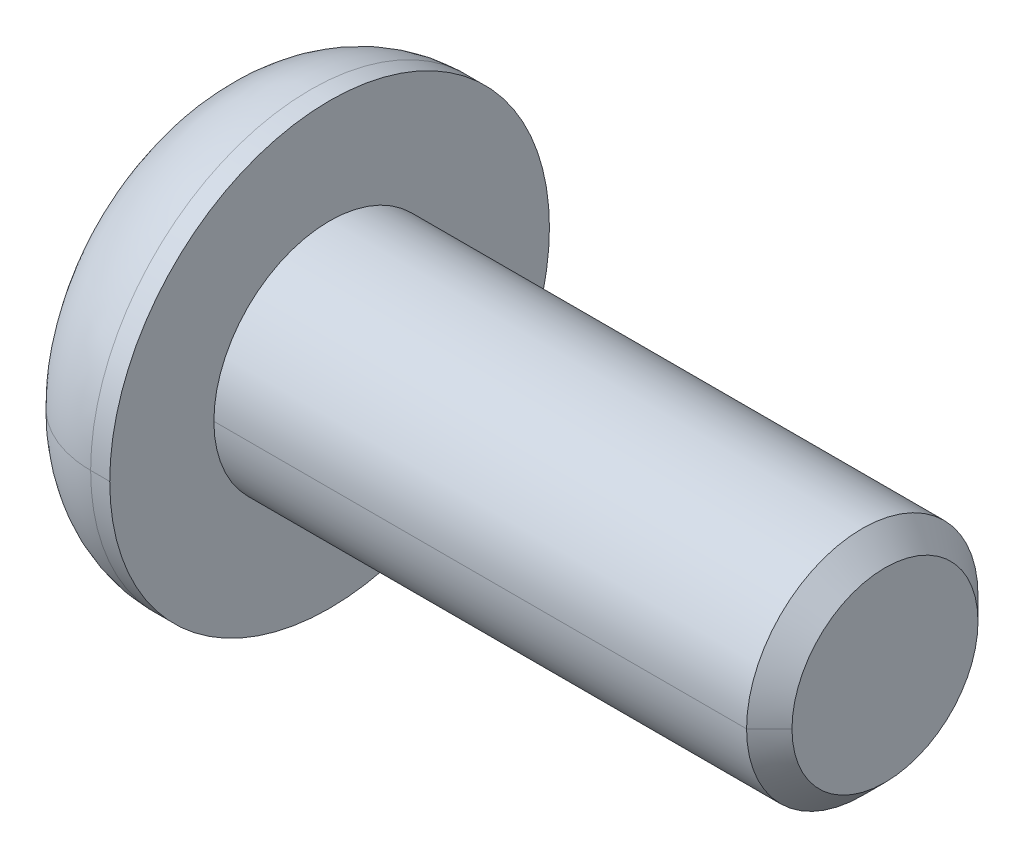
ISO-10303-21;
HEADER;
FILE_DESCRIPTION(('STEP AP214'),'2;1');
FILE_NAME('part.step','',(''),(''),'','','');
FILE_SCHEMA(('AUTOMOTIVE_DESIGN { 1 0 10303 214 1 1 1 1 }'));
ENDSEC;
DATA;
#1=APPLICATION_CONTEXT('core data for automotive mechanical design processes');
#2=APPLICATION_PROTOCOL_DEFINITION('international standard','automotive_design',2000,#1);
#3=PRODUCT_CONTEXT('',#1,'mechanical');
#4=PRODUCT('Part','Part','',(#3));
#5=PRODUCT_RELATED_PRODUCT_CATEGORY('part','',(#4));
#6=PRODUCT_DEFINITION_FORMATION('','',#4);
#7=PRODUCT_DEFINITION_CONTEXT('part definition',#1,'design');
#8=PRODUCT_DEFINITION('design','',#6,#7);
#9=PRODUCT_DEFINITION_SHAPE('','',#8);
#10=(LENGTH_UNIT() NAMED_UNIT(*) SI_UNIT(.MILLI.,.METRE.));
#11=(NAMED_UNIT(*) PLANE_ANGLE_UNIT() SI_UNIT($,.RADIAN.));
#12=(NAMED_UNIT(*) SI_UNIT($,.STERADIAN.) SOLID_ANGLE_UNIT());
#13=UNCERTAINTY_MEASURE_WITH_UNIT(LENGTH_MEASURE(1.E-05),#10,'distance_accuracy_value','');
#14=(GEOMETRIC_REPRESENTATION_CONTEXT(3) GLOBAL_UNCERTAINTY_ASSIGNED_CONTEXT((#13)) GLOBAL_UNIT_ASSIGNED_CONTEXT((#10,
#11,#12)) REPRESENTATION_CONTEXT('',''));
#15=CARTESIAN_POINT('',(0.,0.,0.));
#16=DIRECTION('',(0.,0.,1.));
#17=DIRECTION('',(1.,0.,0.));
#18=AXIS2_PLACEMENT_3D('',#15,#16,#17);
#19=CARTESIAN_POINT('',(11.5095,0.,0.));
#20=DIRECTION('',(-1.,0.,0.));
#21=DIRECTION('',(0.,-1.,0.));
#22=AXIS2_PLACEMENT_3D('',#19,#20,#21);
#23=CONICAL_SURFACE('',#22,2.5,0.7853981634);
#24=CARTESIAN_POINT('',(12.,0.,0.));
#25=DIRECTION('',(1.,0.,0.));
#26=DIRECTION('',(0.,0.,-1.));
#27=AXIS2_PLACEMENT_3D('',#24,#25,#26);
#28=CIRCLE('',#27,2.0095);
#29=CARTESIAN_POINT('',(12.,0.,-2.0095));
#30=VERTEX_POINT('',#29);
#31=CARTESIAN_POINT('',(11.9999999999987,0.,2.00949999999875));
#32=VERTEX_POINT('',#31);
#33=EDGE_CURVE('E10',#30,#32,#28,.T.);
#34=ORIENTED_EDGE('',*,*,#33,.F.);
#35=DIRECTION('',(-0.707106781184742,0.,-0.707106781188354));
#36=VECTOR('',#35,1.);
#37=CARTESIAN_POINT('',(11.9999999999987,0.,-2.00949999999875));
#38=LINE('',#37,#36);
#39=CARTESIAN_POINT('',(11.5095,0.,-2.5));
#40=VERTEX_POINT('',#39);
#41=EDGE_CURVE('E24',#30,#40,#38,.T.);
#42=ORIENTED_EDGE('',*,*,#41,.T.);
#43=CARTESIAN_POINT('',(11.5095,0.,0.));
#44=DIRECTION('',(1.,0.,0.));
#45=DIRECTION('',(0.,0.,-1.));
#46=AXIS2_PLACEMENT_3D('',#43,#44,#45);
#47=CIRCLE('',#46,2.5);
#48=CARTESIAN_POINT('',(11.5095,0.,2.5));
#49=VERTEX_POINT('',#48);
#50=EDGE_CURVE('E174',#40,#49,#47,.T.);
#51=ORIENTED_EDGE('',*,*,#50,.T.);
#52=DIRECTION('',(-0.707106781184742,0.,0.707106781188354));
#53=VECTOR('',#52,1.);
#54=CARTESIAN_POINT('',(11.9999999999987,0.,2.00949999999875));
#55=LINE('',#54,#53);
#56=EDGE_CURVE('E169',#32,#49,#55,.T.);
#57=ORIENTED_EDGE('',*,*,#56,.F.);
#58=EDGE_LOOP('',(#34,#42,#51,#57));
#59=FACE_BOUND('',#58,.T.);
#60=ADVANCED_FACE('F16',(#59),#23,.T.);
#61=CARTESIAN_POINT('',(11.5095,0.,0.));
#62=DIRECTION('',(-1.,0.,0.));
#63=DIRECTION('',(0.,1.,0.));
#64=AXIS2_PLACEMENT_3D('',#61,#62,#63);
#65=CONICAL_SURFACE('',#64,2.5,0.7853981634);
#66=CARTESIAN_POINT('',(11.5095,0.,0.));
#67=DIRECTION('',(1.,0.,0.));
#68=DIRECTION('',(0.,0.,-1.));
#69=AXIS2_PLACEMENT_3D('',#66,#67,#68);
#70=CIRCLE('',#69,2.5);
#71=EDGE_CURVE('E165',#49,#40,#70,.T.);
#72=ORIENTED_EDGE('',*,*,#71,.T.);
#73=ORIENTED_EDGE('',*,*,#41,.F.);
#74=CARTESIAN_POINT('',(12.,0.,0.));
#75=DIRECTION('',(1.,0.,0.));
#76=DIRECTION('',(0.,0.,-1.));
#77=AXIS2_PLACEMENT_3D('',#74,#75,#76);
#78=CIRCLE('',#77,2.0095);
#79=EDGE_CURVE('E160',#32,#30,#78,.T.);
#80=ORIENTED_EDGE('',*,*,#79,.F.);
#81=ORIENTED_EDGE('',*,*,#56,.T.);
#82=EDGE_LOOP('',(#72,#73,#80,#81));
#83=FACE_BOUND('',#82,.T.);
#84=ADVANCED_FACE('F188',(#83),#65,.T.);
#85=CARTESIAN_POINT('',(12.,2.0095,0.));
#86=DIRECTION('',(-1.,0.,0.));
#87=DIRECTION('',(0.,0.,1.));
#88=AXIS2_PLACEMENT_3D('',#85,#86,#87);
#89=PLANE('',#88);
#90=ORIENTED_EDGE('',*,*,#33,.T.);
#91=ORIENTED_EDGE('',*,*,#79,.T.);
#92=EDGE_LOOP('',(#90,#91));
#93=FACE_BOUND('',#92,.T.);
#94=ADVANCED_FACE('F216',(#93),#89,.F.);
#95=CARTESIAN_POINT('',(12.,0.,0.));
#96=DIRECTION('',(-1.,0.,0.));
#97=DIRECTION('',(0.,1.,0.));
#98=AXIS2_PLACEMENT_3D('',#95,#96,#97);
#99=CYLINDRICAL_SURFACE('',#98,2.5);
#100=CARTESIAN_POINT('',(0.,0.,0.));
#101=DIRECTION('',(1.,0.,0.));
#102=DIRECTION('',(0.,0.,-1.));
#103=AXIS2_PLACEMENT_3D('',#100,#101,#102);
#104=CIRCLE('',#103,2.5);
#105=CARTESIAN_POINT('',(0.,0.,2.5));
#106=VERTEX_POINT('',#105);
#107=CARTESIAN_POINT('',(0.,0.,-2.5));
#108=VERTEX_POINT('',#107);
#109=EDGE_CURVE('E156',#106,#108,#104,.T.);
#110=ORIENTED_EDGE('',*,*,#109,.T.);
#111=DIRECTION('',(-1.,0.,0.));
#112=VECTOR('',#111,1.);
#113=CARTESIAN_POINT('',(11.5095,0.,-2.5));
#114=LINE('',#113,#112);
#115=EDGE_CURVE('E151',#40,#108,#114,.T.);
#116=ORIENTED_EDGE('',*,*,#115,.F.);
#117=ORIENTED_EDGE('',*,*,#71,.F.);
#118=DIRECTION('',(-1.,0.,0.));
#119=VECTOR('',#118,1.);
#120=CARTESIAN_POINT('',(11.5095,0.,2.5));
#121=LINE('',#120,#119);
#122=EDGE_CURVE('E147',#49,#106,#121,.T.);
#123=ORIENTED_EDGE('',*,*,#122,.T.);
#124=EDGE_LOOP('',(#110,#116,#117,#123));
#125=FACE_BOUND('',#124,.T.);
#126=ADVANCED_FACE('F191',(#125),#99,.T.);
#127=CARTESIAN_POINT('',(12.,0.,0.));
#128=DIRECTION('',(-1.,0.,0.));
#129=DIRECTION('',(0.,-1.,0.));
#130=AXIS2_PLACEMENT_3D('',#127,#128,#129);
#131=CYLINDRICAL_SURFACE('',#130,2.5);
#132=ORIENTED_EDGE('',*,*,#50,.F.);
#133=ORIENTED_EDGE('',*,*,#115,.T.);
#134=CARTESIAN_POINT('',(0.,0.,0.));
#135=DIRECTION('',(1.,0.,0.));
#136=DIRECTION('',(0.,0.,-1.));
#137=AXIS2_PLACEMENT_3D('',#134,#135,#136);
#138=CIRCLE('',#137,2.5);
#139=EDGE_CURVE('E142',#108,#106,#138,.T.);
#140=ORIENTED_EDGE('',*,*,#139,.T.);
#141=ORIENTED_EDGE('',*,*,#122,.F.);
#142=EDGE_LOOP('',(#132,#133,#140,#141));
#143=FACE_BOUND('',#142,.T.);
#144=ADVANCED_FACE('F192',(#143),#131,.T.);
#145=CARTESIAN_POINT('',(0.,4.75,0.));
#146=DIRECTION('',(-1.,0.,0.));
#147=DIRECTION('',(0.,0.,1.));
#148=AXIS2_PLACEMENT_3D('',#145,#146,#147);
#149=PLANE('',#148);
#150=ORIENTED_EDGE('',*,*,#139,.F.);
#151=ORIENTED_EDGE('',*,*,#109,.F.);
#152=EDGE_LOOP('',(#150,#151));
#153=FACE_BOUND('',#152,.T.);
#154=CARTESIAN_POINT('',(0.,0.,0.));
#155=DIRECTION('',(1.,0.,0.));
#156=DIRECTION('',(0.,0.,-1.));
#157=AXIS2_PLACEMENT_3D('',#154,#155,#156);
#158=CIRCLE('',#157,4.75);
#159=CARTESIAN_POINT('',(0.,0.,-4.75));
#160=VERTEX_POINT('',#159);
#161=CARTESIAN_POINT('',(0.,0.,4.75));
#162=VERTEX_POINT('',#161);
#163=EDGE_CURVE('E138',#160,#162,#158,.T.);
#164=ORIENTED_EDGE('',*,*,#163,.T.);
#165=CARTESIAN_POINT('',(0.,0.,0.));
#166=DIRECTION('',(1.,0.,0.));
#167=DIRECTION('',(0.,0.,-1.));
#168=AXIS2_PLACEMENT_3D('',#165,#166,#167);
#169=CIRCLE('',#168,4.75);
#170=EDGE_CURVE('E134',#162,#160,#169,.T.);
#171=ORIENTED_EDGE('',*,*,#170,.T.);
#172=EDGE_LOOP('',(#164,#171));
#173=FACE_BOUND('',#172,.T.);
#174=ADVANCED_FACE('F196',(#153,#173),#149,.F.);
#175=CARTESIAN_POINT('',(12.,0.,0.));
#176=DIRECTION('',(-1.,0.,0.));
#177=DIRECTION('',(0.,1.,0.));
#178=AXIS2_PLACEMENT_3D('',#175,#176,#177);
#179=CYLINDRICAL_SURFACE('',#178,4.75);
#180=CARTESIAN_POINT('',(-0.4125,0.,0.));
#181=DIRECTION('',(1.,0.,0.));
#182=DIRECTION('',(0.,0.,-1.));
#183=AXIS2_PLACEMENT_3D('',#180,#181,#182);
#184=CIRCLE('',#183,4.75);
#185=CARTESIAN_POINT('',(-0.4125,0.,4.75));
#186=VERTEX_POINT('',#185);
#187=CARTESIAN_POINT('',(-0.4125,0.,-4.75));
#188=VERTEX_POINT('',#187);
#189=EDGE_CURVE('E82',#186,#188,#184,.T.);
#190=ORIENTED_EDGE('',*,*,#189,.T.);
#191=DIRECTION('',(-1.,0.,0.));
#192=VECTOR('',#191,1.);
#193=CARTESIAN_POINT('',(0.,0.,-4.75));
#194=LINE('',#193,#192);
#195=EDGE_CURVE('E126',#160,#188,#194,.T.);
#196=ORIENTED_EDGE('',*,*,#195,.F.);
#197=ORIENTED_EDGE('',*,*,#170,.F.);
#198=DIRECTION('',(-1.,0.,0.));
#199=VECTOR('',#198,1.);
#200=CARTESIAN_POINT('',(0.,0.,4.75));
#201=LINE('',#200,#199);
#202=EDGE_CURVE('E122',#162,#186,#201,.T.);
#203=ORIENTED_EDGE('',*,*,#202,.T.);
#204=EDGE_LOOP('',(#190,#196,#197,#203));
#205=FACE_BOUND('',#204,.T.);
#206=ADVANCED_FACE('F199',(#205),#179,.T.);
#207=CARTESIAN_POINT('',(12.,0.,0.));
#208=DIRECTION('',(-1.,0.,0.));
#209=DIRECTION('',(0.,-1.,0.));
#210=AXIS2_PLACEMENT_3D('',#207,#208,#209);
#211=CYLINDRICAL_SURFACE('',#210,4.75);
#212=ORIENTED_EDGE('',*,*,#163,.F.);
#213=ORIENTED_EDGE('',*,*,#195,.T.);
#214=CARTESIAN_POINT('',(-0.4125,0.,0.));
#215=DIRECTION('',(1.,0.,0.));
#216=DIRECTION('',(0.,0.,-1.));
#217=AXIS2_PLACEMENT_3D('',#214,#215,#216);
#218=CIRCLE('',#217,4.75);
#219=EDGE_CURVE('E119',#188,#186,#218,.T.);
#220=ORIENTED_EDGE('',*,*,#219,.T.);
#221=ORIENTED_EDGE('',*,*,#202,.F.);
#222=EDGE_LOOP('',(#212,#213,#220,#221));
#223=FACE_BOUND('',#222,.T.);
#224=ADVANCED_FACE('F103',(#223),#211,.T.);
#225=CARTESIAN_POINT('',(-0.412500000000154,0.,0.));
#226=DIRECTION('',(1.,0.,0.));
#227=DIRECTION('',(0.,-1.,0.));
#228=AXIS2_PLACEMENT_3D('',#225,#226,#227);
#229=TOROIDAL_SURFACE('',#228,2.4125,2.3375);
#230=ORIENTED_EDGE('',*,*,#219,.F.);
#231=CARTESIAN_POINT('',(-2.75000000000015,0.,-2.41249999999999));
#232=CARTESIAN_POINT('',(-2.75000081132017,0.,-2.45074729293482));
#233=CARTESIAN_POINT('',(-2.7490613000302,0.,-2.48899451683427));
#234=CARTESIAN_POINT('',(-2.74530745772929,0.,-2.56539686064639));
#235=CARTESIAN_POINT('',(-2.74249312671835,0.,-2.60355198055906));
#236=CARTESIAN_POINT('',(-2.73499547047448,0.,-2.67967815048162));
#237=CARTESIAN_POINT('',(-2.73031214524155,0.,-2.7176492004915));
#238=CARTESIAN_POINT('',(-2.71908803884411,0.,-2.7933157675873));
#239=CARTESIAN_POINT('',(-2.7125472576796,0.,-2.83101128467323));
#240=CARTESIAN_POINT('',(-2.69762392820581,0.,-2.90603597075216));
#241=CARTESIAN_POINT('',(-2.68924137989652,0.,-2.94336513974516));
#242=CARTESIAN_POINT('',(-2.67065472878828,0.,-3.01756720130258));
#243=CARTESIAN_POINT('',(-2.66045062598932,0.,-3.05444009386698));
#244=CARTESIAN_POINT('',(-2.63824544355907,0.,-3.12764077229761));
#245=CARTESIAN_POINT('',(-2.62624436392777,0.,-3.16396855816384));
#246=CARTESIAN_POINT('',(-2.60047414080317,0.,-3.23599150644478));
#247=CARTESIAN_POINT('',(-2.58670499730986,0.,-3.27168666885949));
#248=CARTESIAN_POINT('',(-2.55743181718072,0.,-3.34235837744728));
#249=CARTESIAN_POINT('',(-2.54192778054487,0.,-3.37733492362036));
#250=CARTESIAN_POINT('',(-2.50922216480754,0.,-3.44648513816619));
#251=CARTESIAN_POINT('',(-2.49202058570606,0.,-3.48065880653896));
#252=CARTESIAN_POINT('',(-2.45596132512282,0.,-3.54812093812256));
#253=CARTESIAN_POINT('',(-2.43710364364107,0.,-3.5814094013334));
#254=CARTESIAN_POINT('',(-2.39777760811052,0.,-3.64702092776989));
#255=CARTESIAN_POINT('',(-2.37730925406173,0.,-3.67934399099554));
#256=CARTESIAN_POINT('',(-2.33481118345299,0.,-3.74294684837108));
#257=CARTESIAN_POINT('',(-2.31278146689305,0.,-3.77422664252098));
#258=CARTESIAN_POINT('',(-2.26721374277928,0.,-3.83566760598114));
#259=CARTESIAN_POINT('',(-2.24367573522545,0.,-3.8658287752914));
#260=CARTESIAN_POINT('',(-2.19514813424566,0.,-3.92495982817363));
#261=CARTESIAN_POINT('',(-2.1701585408197,0.,-3.95392971174559));
#262=CARTESIAN_POINT('',(-2.11878797021506,0.,-4.01060840216421));
#263=CARTESIAN_POINT('',(-2.09240699303639,0.,-4.03831720901088));
#264=CARTESIAN_POINT('',(-2.03831720901105,0.,-4.09240699303622));
#265=CARTESIAN_POINT('',(-2.01060840216438,0.,-4.11878797021489));
#266=CARTESIAN_POINT('',(-1.95392971174575,0.,-4.17015854081953));
#267=CARTESIAN_POINT('',(-1.9249598281738,0.,-4.1951481342455));
#268=CARTESIAN_POINT('',(-1.86582877529157,0.,-4.24367573522529));
#269=CARTESIAN_POINT('',(-1.8356676059813,0.,-4.26721374277912));
#270=CARTESIAN_POINT('',(-1.77422664252115,0.,-4.31278146689289));
#271=CARTESIAN_POINT('',(-1.74294684837125,0.,-4.33481118345283));
#272=CARTESIAN_POINT('',(-1.67934399099571,0.,-4.37730925406156));
#273=CARTESIAN_POINT('',(-1.64702092777006,0.,-4.39777760811036));
#274=CARTESIAN_POINT('',(-1.58140940133357,0.,-4.4371036436409));
#275=CARTESIAN_POINT('',(-1.54812093812273,0.,-4.45596132512266));
#276=CARTESIAN_POINT('',(-1.48065880653913,0.,-4.49202058570589));
#277=CARTESIAN_POINT('',(-1.44648513816637,0.,-4.50922216480738));
#278=CARTESIAN_POINT('',(-1.37733492362053,0.,-4.54192778054471));
#279=CARTESIAN_POINT('',(-1.34235837744746,0.,-4.55743181718055));
#280=CARTESIAN_POINT('',(-1.27168666885967,0.,-4.5867049973097));
#281=CARTESIAN_POINT('',(-1.23599150644495,0.,-4.60047414080301));
#282=CARTESIAN_POINT('',(-1.16396855816401,0.,-4.62624436392761));
#283=CARTESIAN_POINT('',(-1.12764077229778,0.,-4.63824544355891));
#284=CARTESIAN_POINT('',(-1.05444009386715,0.,-4.66045062598916));
#285=CARTESIAN_POINT('',(-1.01756720130275,0.,-4.67065472878812));
#286=CARTESIAN_POINT('',(-0.943365139745337,0.,-4.68924137989637));
#287=CARTESIAN_POINT('',(-0.906035970752329,0.,-4.69762392820565));
#288=CARTESIAN_POINT('',(-0.831011284673399,0.,-4.71254725767945));
#289=CARTESIAN_POINT('',(-0.793315767587475,0.,-4.71908803884395));
#290=CARTESIAN_POINT('',(-0.71764920049167,0.,-4.73031214524139));
#291=CARTESIAN_POINT('',(-0.679678150481789,0.,-4.73499547047432));
#292=CARTESIAN_POINT('',(-0.603551980559236,0.,-4.74249312671819));
#293=CARTESIAN_POINT('',(-0.565396860646564,0.,-4.74530745772914));
#294=CARTESIAN_POINT('',(-0.488994516834444,0.,-4.74906130003004));
#295=CARTESIAN_POINT('',(-0.450747292934995,0.,-4.75000081132001));
#296=CARTESIAN_POINT('',(-0.412500000000165,0.,-4.75));
#297=B_SPLINE_CURVE_WITH_KNOTS('',3,(#231,#232,#233,#234,#235,#236,#237,#238,#239,#240,#241,
#242,#243,#244,#245,#246,#247,#248,#249,#250,#251,#252,#253,#254,#255,#256,#257,#258,#259,#260,
#261,#262,#263,#264,#265,#266,#267,#268,#269,#270,#271,#272,#273,#274,#275,#276,#277,#278,#279,
#280,#281,#282,#283,#284,#285,#286,#287,#288,#289,#290,#291,#292,#293,#294,#295,#296),
.UNSPECIFIED.,.F.,.F.,(4,2,2,2,2,2,2,2,2,2,2,2,2,2,2,2,2,2,2,2,2,2,2,2,2,2,2,2,2,2,2,2,4),(0.,
0.114730243344615,0.22946048668923,0.344190730033845,0.458920973378459,0.573651216723075,
0.688381460067689,0.803111703412304,0.917841946756919,1.03257219010153,1.14730243344615,
1.26203267679076,1.37676292013538,1.49149316347999,1.60622340682461,1.72095365016922,
1.83568389351384,1.95041413685845,2.06514438020307,2.17987462354768,2.2946048668923,
2.40933511023691,2.52406535358153,2.63879559692614,2.75352584027076,2.86825608361537,
2.98298632695999,3.0977165703046,3.21244681364922,3.32717705699383,3.44190730033845,
3.55663754368306,3.67136778702767),.UNSPECIFIED.);
#298=CARTESIAN_POINT('',(-2.75,0.,-2.4125));
#299=VERTEX_POINT('',#298);
#300=EDGE_CURVE('E72',#299,#188,#297,.T.);
#301=ORIENTED_EDGE('',*,*,#300,.F.);
#302=CARTESIAN_POINT('',(-2.75,0.,0.));
#303=DIRECTION('',(1.,0.,0.));
#304=DIRECTION('',(0.,0.,-1.));
#305=AXIS2_PLACEMENT_3D('',#302,#303,#304);
#306=CIRCLE('',#305,2.4125);
#307=CARTESIAN_POINT('',(-2.75000000000015,0.,2.4125));
#308=VERTEX_POINT('',#307);
#309=EDGE_CURVE('E64',#299,#308,#306,.T.);
#310=ORIENTED_EDGE('',*,*,#309,.T.);
#311=CARTESIAN_POINT('',(-2.75000000000015,0.,2.41249999999999));
#312=CARTESIAN_POINT('',(-2.75000081132017,0.,2.45074729293483));
#313=CARTESIAN_POINT('',(-2.7490613000302,0.,2.48899451683427));
#314=CARTESIAN_POINT('',(-2.74530745772929,0.,2.56539686064639));
#315=CARTESIAN_POINT('',(-2.74249312671835,0.,2.60355198055907));
#316=CARTESIAN_POINT('',(-2.73499547047448,0.,2.67967815048162));
#317=CARTESIAN_POINT('',(-2.73031214524155,0.,2.7176492004915));
#318=CARTESIAN_POINT('',(-2.71908803884411,0.,2.7933157675873));
#319=CARTESIAN_POINT('',(-2.7125472576796,0.,2.83101128467323));
#320=CARTESIAN_POINT('',(-2.69762392820581,0.,2.90603597075216));
#321=CARTESIAN_POINT('',(-2.68924137989652,0.,2.94336513974517));
#322=CARTESIAN_POINT('',(-2.67065472878828,0.,3.01756720130258));
#323=CARTESIAN_POINT('',(-2.66045062598932,0.,3.05444009386699));
#324=CARTESIAN_POINT('',(-2.63824544355907,0.,3.12764077229761));
#325=CARTESIAN_POINT('',(-2.62624436392777,0.,3.16396855816384));
#326=CARTESIAN_POINT('',(-2.60047414080317,0.,3.23599150644478));
#327=CARTESIAN_POINT('',(-2.58670499730986,0.,3.2716866688595));
#328=CARTESIAN_POINT('',(-2.55743181718072,0.,3.34235837744729));
#329=CARTESIAN_POINT('',(-2.54192778054487,0.,3.37733492362036));
#330=CARTESIAN_POINT('',(-2.50922216480754,0.,3.4464851381662));
#331=CARTESIAN_POINT('',(-2.49202058570605,0.,3.48065880653896));
#332=CARTESIAN_POINT('',(-2.45596132512282,0.,3.54812093812257));
#333=CARTESIAN_POINT('',(-2.43710364364107,0.,3.58140940133341));
#334=CARTESIAN_POINT('',(-2.39777760811052,0.,3.64702092776989));
#335=CARTESIAN_POINT('',(-2.37730925406172,0.,3.67934399099554));
#336=CARTESIAN_POINT('',(-2.33481118345299,0.,3.74294684837109));
#337=CARTESIAN_POINT('',(-2.31278146689305,0.,3.77422664252098));
#338=CARTESIAN_POINT('',(-2.26721374277928,0.,3.83566760598114));
#339=CARTESIAN_POINT('',(-2.24367573522545,0.,3.8658287752914));
#340=CARTESIAN_POINT('',(-2.19514813424566,0.,3.92495982817363));
#341=CARTESIAN_POINT('',(-2.17015854081969,0.,3.95392971174559));
#342=CARTESIAN_POINT('',(-2.11878797021506,0.,4.01060840216421));
#343=CARTESIAN_POINT('',(-2.09240699303638,0.,4.03831720901088));
#344=CARTESIAN_POINT('',(-2.03831720901104,0.,4.09240699303622));
#345=CARTESIAN_POINT('',(-2.01060840216438,0.,4.11878797021489));
#346=CARTESIAN_POINT('',(-1.95392971174575,0.,4.17015854081953));
#347=CARTESIAN_POINT('',(-1.92495982817379,0.,4.1951481342455));
#348=CARTESIAN_POINT('',(-1.86582877529157,0.,4.24367573522529));
#349=CARTESIAN_POINT('',(-1.8356676059813,0.,4.26721374277912));
#350=CARTESIAN_POINT('',(-1.77422664252114,0.,4.31278146689289));
#351=CARTESIAN_POINT('',(-1.74294684837125,0.,4.33481118345283));
#352=CARTESIAN_POINT('',(-1.67934399099571,0.,4.37730925406156));
#353=CARTESIAN_POINT('',(-1.64702092777006,0.,4.39777760811036));
#354=CARTESIAN_POINT('',(-1.58140940133357,0.,4.43710364364091));
#355=CARTESIAN_POINT('',(-1.54812093812273,0.,4.45596132512266));
#356=CARTESIAN_POINT('',(-1.48065880653913,0.,4.49202058570589));
#357=CARTESIAN_POINT('',(-1.44648513816636,0.,4.50922216480738));
#358=CARTESIAN_POINT('',(-1.37733492362053,0.,4.54192778054471));
#359=CARTESIAN_POINT('',(-1.34235837744745,0.,4.55743181718056));
#360=CARTESIAN_POINT('',(-1.27168666885966,0.,4.58670499730971));
#361=CARTESIAN_POINT('',(-1.23599150644495,0.,4.60047414080301));
#362=CARTESIAN_POINT('',(-1.16396855816401,0.,4.62624436392761));
#363=CARTESIAN_POINT('',(-1.12764077229778,0.,4.63824544355891));
#364=CARTESIAN_POINT('',(-1.05444009386715,0.,4.66045062598916));
#365=CARTESIAN_POINT('',(-1.01756720130275,0.,4.67065472878812));
#366=CARTESIAN_POINT('',(-0.943365139745335,0.,4.68924137989637));
#367=CARTESIAN_POINT('',(-0.906035970752328,0.,4.69762392820565));
#368=CARTESIAN_POINT('',(-0.831011284673397,0.,4.71254725767945));
#369=CARTESIAN_POINT('',(-0.793315767587473,0.,4.71908803884395));
#370=CARTESIAN_POINT('',(-0.717649200491668,0.,4.73031214524139));
#371=CARTESIAN_POINT('',(-0.679678150481787,0.,4.73499547047432));
#372=CARTESIAN_POINT('',(-0.603551980559234,0.,4.7424931267182));
#373=CARTESIAN_POINT('',(-0.565396860646562,0.,4.74530745772914));
#374=CARTESIAN_POINT('',(-0.488994516834442,0.,4.74906130003004));
#375=CARTESIAN_POINT('',(-0.450747292934993,0.,4.75000081132001));
#376=CARTESIAN_POINT('',(-0.412500000000163,0.,4.75));
#377=B_SPLINE_CURVE_WITH_KNOTS('',3,(#311,#312,#313,#314,#315,#316,#317,#318,#319,#320,#321,
#322,#323,#324,#325,#326,#327,#328,#329,#330,#331,#332,#333,#334,#335,#336,#337,#338,#339,#340,
#341,#342,#343,#344,#345,#346,#347,#348,#349,#350,#351,#352,#353,#354,#355,#356,#357,#358,#359,
#360,#361,#362,#363,#364,#365,#366,#367,#368,#369,#370,#371,#372,#373,#374,#375,#376),
.UNSPECIFIED.,.F.,.F.,(4,2,2,2,2,2,2,2,2,2,2,2,2,2,2,2,2,2,2,2,2,2,2,2,2,2,2,2,2,2,2,2,4),(0.,
0.114730243344615,0.22946048668923,0.344190730033844,0.458920973378459,0.573651216723074,
0.688381460067689,0.803111703412304,0.917841946756919,1.03257219010153,1.14730243344615,
1.26203267679076,1.37676292013538,1.49149316347999,1.60622340682461,1.72095365016922,
1.83568389351384,1.95041413685845,2.06514438020307,2.17987462354768,2.2946048668923,
2.40933511023691,2.52406535358153,2.63879559692614,2.75352584027076,2.86825608361537,
2.98298632695999,3.0977165703046,3.21244681364922,3.32717705699383,3.44190730033845,
3.55663754368306,3.67136778702767),.UNSPECIFIED.);
#378=EDGE_CURVE('E68',#308,#186,#377,.T.);
#379=ORIENTED_EDGE('',*,*,#378,.T.);
#380=EDGE_LOOP('',(#230,#301,#310,#379));
#381=FACE_BOUND('',#380,.T.);
#382=ADVANCED_FACE('F67',(#381),#229,.T.);
#383=CARTESIAN_POINT('',(-0.412500000000154,0.,0.));
#384=DIRECTION('',(1.,0.,0.));
#385=DIRECTION('',(0.,1.,0.));
#386=AXIS2_PLACEMENT_3D('',#383,#384,#385);
#387=TOROIDAL_SURFACE('',#386,2.4125,2.3375);
#388=CARTESIAN_POINT('',(-2.75,0.,0.));
#389=DIRECTION('',(1.,0.,0.));
#390=DIRECTION('',(0.,0.,-1.));
#391=AXIS2_PLACEMENT_3D('',#388,#389,#390);
#392=CIRCLE('',#391,2.4125);
#393=EDGE_CURVE('E81',#308,#299,#392,.T.);
#394=ORIENTED_EDGE('',*,*,#393,.T.);
#395=ORIENTED_EDGE('',*,*,#300,.T.);
#396=ORIENTED_EDGE('',*,*,#189,.F.);
#397=ORIENTED_EDGE('',*,*,#378,.F.);
#398=EDGE_LOOP('',(#394,#395,#396,#397));
#399=FACE_BOUND('',#398,.T.);
#400=ADVANCED_FACE('F80',(#399),#387,.T.);
#401=CARTESIAN_POINT('',(-2.75,0.,0.));
#402=DIRECTION('',(1.,0.,0.));
#403=DIRECTION('',(0.,0.,-1.));
#404=AXIS2_PLACEMENT_3D('',#401,#402,#403);
#405=PLANE('',#404);
#406=ORIENTED_EDGE('',*,*,#309,.F.);
#407=ORIENTED_EDGE('',*,*,#393,.F.);
#408=EDGE_LOOP('',(#406,#407));
#409=FACE_BOUND('',#408,.T.);
#410=ADVANCED_FACE('F85',(#409),#405,.F.);
#411=CLOSED_SHELL('',(#60,#84,#94,#126,#144,#174,#206,#224,#382,#400,#410));
#412=MANIFOLD_SOLID_BREP('B1',#411);
#413=ADVANCED_BREP_SHAPE_REPRESENTATION('',(#18,#412),#14);
#414=SHAPE_DEFINITION_REPRESENTATION(#9,#413);
ENDSEC;
END-ISO-10303-21;
